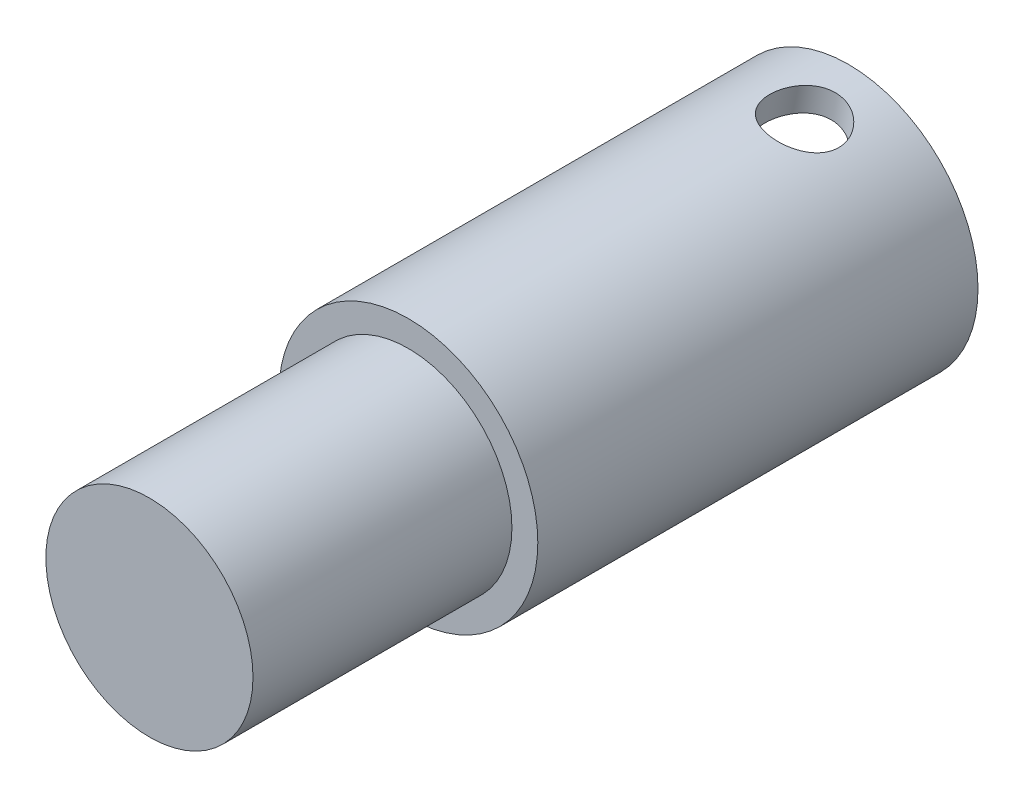
ISO-10303-21;
HEADER;
FILE_DESCRIPTION(('STEP AP214'),'2;1');
FILE_NAME('part.step','',(''),(''),'','','');
FILE_SCHEMA(('AUTOMOTIVE_DESIGN { 1 0 10303 214 1 1 1 1 }'));
ENDSEC;
DATA;
#1=APPLICATION_CONTEXT('core data for automotive mechanical design processes');
#2=APPLICATION_PROTOCOL_DEFINITION('international standard','automotive_design',2000,#1);
#3=PRODUCT_CONTEXT('',#1,'mechanical');
#4=PRODUCT('Part','Part','',(#3));
#5=PRODUCT_RELATED_PRODUCT_CATEGORY('part','',(#4));
#6=PRODUCT_DEFINITION_FORMATION('','',#4);
#7=PRODUCT_DEFINITION_CONTEXT('part definition',#1,'design');
#8=PRODUCT_DEFINITION('design','',#6,#7);
#9=PRODUCT_DEFINITION_SHAPE('','',#8);
#10=(LENGTH_UNIT() NAMED_UNIT(*) SI_UNIT(.MILLI.,.METRE.));
#11=(NAMED_UNIT(*) PLANE_ANGLE_UNIT() SI_UNIT($,.RADIAN.));
#12=(NAMED_UNIT(*) SI_UNIT($,.STERADIAN.) SOLID_ANGLE_UNIT());
#13=UNCERTAINTY_MEASURE_WITH_UNIT(LENGTH_MEASURE(1.E-05),#10,'distance_accuracy_value','');
#14=(GEOMETRIC_REPRESENTATION_CONTEXT(3) GLOBAL_UNCERTAINTY_ASSIGNED_CONTEXT((#13)) GLOBAL_UNIT_ASSIGNED_CONTEXT((#10,
#11,#12)) REPRESENTATION_CONTEXT('',''));
#15=CARTESIAN_POINT('',(0.,0.,0.));
#16=DIRECTION('',(0.,0.,1.));
#17=DIRECTION('',(1.,0.,0.));
#18=AXIS2_PLACEMENT_3D('',#15,#16,#17);
#19=CARTESIAN_POINT('',(0.,0.,13.5));
#20=DIRECTION('',(0.,0.,-1.));
#21=DIRECTION('',(-1.,0.,0.));
#22=AXIS2_PLACEMENT_3D('',#19,#20,#21);
#23=CYLINDRICAL_SURFACE('',#22,5.);
#24=CARTESIAN_POINT('',(-0.547085215267012,4.96997965460989,-11.));
#25=CARTESIAN_POINT('',(-0.547083321598174,4.96998060751569,-11.0744662451277));
#26=CARTESIAN_POINT('',(-0.540711911143652,4.9706938124909,-11.1489504370846));
#27=CARTESIAN_POINT('',(-0.515469381920347,4.97337381957333,-11.2957647987417));
#28=CARTESIAN_POINT('',(-0.496592228577024,4.97534122687138,-11.3680939109039));
#29=CARTESIAN_POINT('',(-0.447077244389713,4.98003359986975,-11.5084529313072));
#30=CARTESIAN_POINT('',(-0.416456277211684,4.98275747776716,-11.576488842031));
#31=CARTESIAN_POINT('',(-0.344480934785907,4.98824921962202,-11.7066130735163));
#32=CARTESIAN_POINT('',(-0.303125637390755,4.99101708733931,-11.7687008826703));
#33=CARTESIAN_POINT('',(-0.209846123031868,4.99581728937175,-11.8867643826359));
#34=CARTESIAN_POINT('',(-0.157698456401351,4.99783101859141,-11.9425643237734));
#35=CARTESIAN_POINT('',(-0.0449590733494553,5.00011526679256,-12.0449132115629));
#36=CARTESIAN_POINT('',(0.0156335388951549,5.0003856006941,-12.0914611755108));
#37=CARTESIAN_POINT('',(0.144641472704723,4.99832995771647,-12.174720962709));
#38=CARTESIAN_POINT('',(0.213169498459633,4.9959610118052,-12.2112575711502));
#39=CARTESIAN_POINT('',(0.355202729017113,4.98787357291976,-12.272313985301));
#40=CARTESIAN_POINT('',(0.428707066703341,4.98215566217689,-12.2968358784577));
#41=CARTESIAN_POINT('',(0.576687159543503,4.96717525326311,-12.3325965694713));
#42=CARTESIAN_POINT('',(0.651099322729406,4.95799935775511,-12.3441344458619));
#43=CARTESIAN_POINT('',(0.800283574052375,4.93611443218687,-12.3545410600551));
#44=CARTESIAN_POINT('',(0.875055598054032,4.92340601034404,-12.3534119774922));
#45=CARTESIAN_POINT('',(1.02079482867167,4.89523721075833,-12.338726257995));
#46=CARTESIAN_POINT('',(1.09181041892729,4.87985679077243,-12.3254928274463));
#47=CARTESIAN_POINT('',(1.23013040968751,4.84683796075532,-12.2874968471685));
#48=CARTESIAN_POINT('',(1.29743459529237,4.82919942016922,-12.262733630618));
#49=CARTESIAN_POINT('',(1.42729595417729,4.79243474392783,-12.2021365333472));
#50=CARTESIAN_POINT('',(1.48979806279616,4.77329533584077,-12.1661929253484));
#51=CARTESIAN_POINT('',(1.60783798770531,4.73484070135062,-12.0843398312213));
#52=CARTESIAN_POINT('',(1.66337440908328,4.71552544056018,-12.0384283539905));
#53=CARTESIAN_POINT('',(1.7678792995524,4.67737087757114,-11.936231245046));
#54=CARTESIAN_POINT('',(1.81658510229174,4.65856584631997,-11.8796638856812));
#55=CARTESIAN_POINT('',(1.90412953273557,4.62347501798437,-11.7586492894447));
#56=CARTESIAN_POINT('',(1.94296752216446,4.60718938388768,-11.6942015432486));
#57=CARTESIAN_POINT('',(2.01000910852481,4.57834140614818,-11.5586682669496));
#58=CARTESIAN_POINT('',(2.03814188382045,4.56580397216036,-11.4875422843988));
#59=CARTESIAN_POINT('',(2.08259321913688,4.54570206288559,-11.3410260903594));
#60=CARTESIAN_POINT('',(2.09891480714286,4.53813631307432,-11.265636977139));
#61=CARTESIAN_POINT('',(2.1189192826603,4.52882986367957,-11.1152152883209));
#62=CARTESIAN_POINT('',(2.12297484071241,4.5269174447979,-11.0402428371618));
#63=CARTESIAN_POINT('',(2.11937778266349,4.528602653463,-10.8906474685758));
#64=CARTESIAN_POINT('',(2.1117264538666,4.53219967518471,-10.8160245136228));
#65=CARTESIAN_POINT('',(2.08522857499778,4.54444996976621,-10.6707846619683));
#66=CARTESIAN_POINT('',(2.06660807763815,4.5530010912517,-10.6001175747511));
#67=CARTESIAN_POINT('',(2.01888265754548,4.57436246337573,-10.4631025838347));
#68=CARTESIAN_POINT('',(1.98977633649011,4.58717328204266,-10.3967552575851));
#69=CARTESIAN_POINT('',(1.92104627830005,4.61638401571195,-10.2686125154846));
#70=CARTESIAN_POINT('',(1.88120033191358,4.63285829886372,-10.2069533536525));
#71=CARTESIAN_POINT('',(1.79225540760774,4.66798698147889,-10.0914134341513));
#72=CARTESIAN_POINT('',(1.7431546378835,4.68664180284512,-10.0375341863067));
#73=CARTESIAN_POINT('',(1.63520303592371,4.72540908372448,-9.93743118339922));
#74=CARTESIAN_POINT('',(1.57610493673625,4.74554843073444,-9.89148391650718));
#75=CARTESIAN_POINT('',(1.45067092921861,4.78538163191099,-9.81058034381805));
#76=CARTESIAN_POINT('',(1.3843354064694,4.80507550974298,-9.77562345288248));
#77=CARTESIAN_POINT('',(1.24665904626364,4.84261170365861,-9.71801703299766));
#78=CARTESIAN_POINT('',(1.17536051427002,4.86046706580384,-9.69527513911034));
#79=CARTESIAN_POINT('',(1.02930781062782,4.8934776531844,-9.66247891969335));
#80=CARTESIAN_POINT('',(0.95455443279308,4.90863349483726,-9.6524216945063));
#81=CARTESIAN_POINT('',(0.806215626463691,4.93513074634238,-9.6454663266512));
#82=CARTESIAN_POINT('',(0.732667720519123,4.94657738446424,-9.64816316127778));
#83=CARTESIAN_POINT('',(0.586575355129643,4.9660205448129,-9.66569588680142));
#84=CARTESIAN_POINT('',(0.514030856155521,4.97401720332847,-9.68053129810629));
#85=CARTESIAN_POINT('',(0.372558339430831,4.98660324877152,-9.72168840902185));
#86=CARTESIAN_POINT('',(0.303607864781299,4.99121698297595,-9.7479258225676));
#87=CARTESIAN_POINT('',(0.170636154849089,4.9975313176076,-9.81106703223902));
#88=CARTESIAN_POINT('',(0.106615627788326,4.99923150022534,-9.84797235727916));
#89=CARTESIAN_POINT('',(-0.0164668102881935,5.0003622988874,-9.93257531391776));
#90=CARTESIAN_POINT('',(-0.075345757851252,4.99972972234522,-9.98053994506002));
#91=CARTESIAN_POINT('',(-0.184509957524835,4.99689345804244,-10.0853964340939));
#92=CARTESIAN_POINT('',(-0.234792922361951,4.99468935292379,-10.1422906603281));
#93=CARTESIAN_POINT('',(-0.326337601576946,4.98955492681884,-10.2649525919399));
#94=CARTESIAN_POINT('',(-0.367367332822861,4.98660918507151,-10.3308931252633));
#95=CARTESIAN_POINT('',(-0.437519248966799,4.98094606210139,-10.468814625793));
#96=CARTESIAN_POINT('',(-0.466649006342541,4.97822853653208,-10.5407917164098));
#97=CARTESIAN_POINT('',(-0.508375039053716,4.97412504690405,-10.6770560593604));
#98=CARTESIAN_POINT('',(-0.522852928505865,4.97259676119865,-10.7407685910123));
#99=CARTESIAN_POINT('',(-0.542208260645173,4.97052370790588,-10.8696496171006));
#100=CARTESIAN_POINT('',(-0.547086872840164,4.9699788205089,-10.934817933196));
#101=CARTESIAN_POINT('',(-0.547085215267012,4.96997965460989,-11.));
#102=B_SPLINE_CURVE_WITH_KNOTS('',3,(#24,#25,#26,#27,#28,#29,#30,#31,#32,#33,#34,#35,#36,#37,
#38,#39,#40,#41,#42,#43,#44,#45,#46,#47,#48,#49,#50,#51,#52,#53,#54,#55,#56,#57,#58,#59,#60,#61,
#62,#63,#64,#65,#66,#67,#68,#69,#70,#71,#72,#73,#74,#75,#76,#77,#78,#79,#80,#81,#82,#83,#84,#85,
#86,#87,#88,#89,#90,#91,#92,#93,#94,#95,#96,#97,#98,#99,#100,#101),.UNSPECIFIED.,.T.,.F.,(4,2,2,
2,2,2,2,2,2,2,2,2,2,2,2,2,2,2,2,2,2,2,2,2,2,2,2,2,2,2,2,2,2,2,2,2,2,2,4),(0.,0.223158971319737,
0.446425705234324,0.669373029858269,0.892339513421352,1.12049196410997,1.34866863520864,
1.58061515285875,1.81252135761807,2.03896881868822,2.26537731498979,2.48591139891143,
2.70645823893681,2.92924177634403,3.15206985623524,3.38193184216986,3.61180869238737,
3.84318092210092,4.07449381484002,4.29870449991732,4.52289053227474,4.74261062665067,
4.96236003234462,5.1870610190489,5.41180555435868,5.64325797169597,5.87469806418976,
6.10436254033136,6.33397450670088,6.5563446970923,6.7787061021164,6.99945100329827,
7.22022755711893,7.44702816047026,7.67388901874331,7.90592550303216,8.13781410141318,
8.33317423343228,8.52851056268489),.UNSPECIFIED.);
#103=CARTESIAN_POINT('',(-0.547085215267012,4.96997965460989,-11.));
#104=VERTEX_POINT('',#103);
#105=EDGE_CURVE('E67',#104,#104,#102,.T.);
#106=ORIENTED_EDGE('',*,*,#105,.T.);
#107=EDGE_LOOP('',(#106));
#108=FACE_BOUND('',#107,.T.);
#109=CARTESIAN_POINT('',(0.,0.,-13.5));
#110=DIRECTION('',(0.,0.,1.));
#111=DIRECTION('',(1.,0.,0.));
#112=AXIS2_PLACEMENT_3D('',#109,#110,#111);
#113=CIRCLE('',#112,5.);
#114=CARTESIAN_POINT('',(5.,0.,-13.5));
#115=VERTEX_POINT('',#114);
#116=EDGE_CURVE('E10',#115,#115,#113,.T.);
#117=ORIENTED_EDGE('',*,*,#116,.T.);
#118=EDGE_LOOP('',(#117));
#119=FACE_BOUND('',#118,.T.);
#120=CARTESIAN_POINT('',(0.,0.,3.5));
#121=DIRECTION('',(0.,0.,1.));
#122=DIRECTION('',(1.,0.,0.));
#123=AXIS2_PLACEMENT_3D('',#120,#121,#122);
#124=CIRCLE('',#123,5.);
#125=CARTESIAN_POINT('',(5.,0.,3.5));
#126=VERTEX_POINT('',#125);
#127=EDGE_CURVE('E44',#126,#126,#124,.T.);
#128=ORIENTED_EDGE('',*,*,#127,.F.);
#129=EDGE_LOOP('',(#128));
#130=FACE_BOUND('',#129,.T.);
#131=ADVANCED_FACE('F37',(#108,#119,#130),#23,.T.);
#132=CARTESIAN_POINT('',(0.,0.,-13.5));
#133=DIRECTION('',(0.,0.,1.));
#134=DIRECTION('',(1.,0.,0.));
#135=AXIS2_PLACEMENT_3D('',#132,#133,#134);
#136=PLANE('',#135);
#137=CARTESIAN_POINT('',(0.,0.,-13.5));
#138=DIRECTION('',(0.,0.,-1.));
#139=DIRECTION('',(-1.,0.,0.));
#140=AXIS2_PLACEMENT_3D('',#137,#138,#139);
#141=CIRCLE('',#140,4.);
#142=CARTESIAN_POINT('',(-4.,0.,-13.5));
#143=VERTEX_POINT('',#142);
#144=EDGE_CURVE('E58',#143,#143,#141,.T.);
#145=ORIENTED_EDGE('',*,*,#144,.F.);
#146=EDGE_LOOP('',(#145));
#147=FACE_BOUND('',#146,.T.);
#148=ORIENTED_EDGE('',*,*,#116,.F.);
#149=EDGE_LOOP('',(#148));
#150=FACE_BOUND('',#149,.T.);
#151=ADVANCED_FACE('F112',(#147,#150),#136,.F.);
#152=CARTESIAN_POINT('',(0.,0.,3.5));
#153=DIRECTION('',(0.,0.,1.));
#154=DIRECTION('',(1.,0.,0.));
#155=AXIS2_PLACEMENT_3D('',#152,#153,#154);
#156=PLANE('',#155);
#157=CARTESIAN_POINT('',(0.,0.,3.5));
#158=DIRECTION('',(0.,0.,1.));
#159=DIRECTION('',(1.,0.,0.));
#160=AXIS2_PLACEMENT_3D('',#157,#158,#159);
#161=CIRCLE('',#160,4.);
#162=CARTESIAN_POINT('',(4.,0.,3.5));
#163=VERTEX_POINT('',#162);
#164=EDGE_CURVE('E48',#163,#163,#161,.T.);
#165=ORIENTED_EDGE('',*,*,#164,.F.);
#166=EDGE_LOOP('',(#165));
#167=FACE_BOUND('',#166,.T.);
#168=ORIENTED_EDGE('',*,*,#127,.T.);
#169=EDGE_LOOP('',(#168));
#170=FACE_BOUND('',#169,.T.);
#171=ADVANCED_FACE('F108',(#167,#170),#156,.T.);
#172=CARTESIAN_POINT('',(0.,0.,3.5));
#173=DIRECTION('',(0.,0.,1.));
#174=DIRECTION('',(1.,0.,0.));
#175=AXIS2_PLACEMENT_3D('',#172,#173,#174);
#176=CYLINDRICAL_SURFACE('',#175,4.);
#177=ORIENTED_EDGE('',*,*,#164,.T.);
#178=EDGE_LOOP('',(#177));
#179=FACE_BOUND('',#178,.T.);
#180=CARTESIAN_POINT('',(0.,0.,13.5));
#181=DIRECTION('',(0.,0.,1.));
#182=DIRECTION('',(1.,0.,0.));
#183=AXIS2_PLACEMENT_3D('',#180,#181,#182);
#184=CIRCLE('',#183,4.);
#185=CARTESIAN_POINT('',(4.,0.,13.5));
#186=VERTEX_POINT('',#185);
#187=EDGE_CURVE('E52',#186,#186,#184,.T.);
#188=ORIENTED_EDGE('',*,*,#187,.F.);
#189=EDGE_LOOP('',(#188));
#190=FACE_BOUND('',#189,.T.);
#191=ADVANCED_FACE('F105',(#179,#190),#176,.T.);
#192=CARTESIAN_POINT('',(0.,0.,13.5));
#193=DIRECTION('',(0.,0.,1.));
#194=DIRECTION('',(1.,0.,0.));
#195=AXIS2_PLACEMENT_3D('',#192,#193,#194);
#196=PLANE('',#195);
#197=ORIENTED_EDGE('',*,*,#187,.T.);
#198=EDGE_LOOP('',(#197));
#199=FACE_BOUND('',#198,.T.);
#200=ADVANCED_FACE('F103',(#199),#196,.T.);
#201=CARTESIAN_POINT('',(0.,0.,-6.));
#202=DIRECTION('',(0.,0.,-1.));
#203=DIRECTION('',(-1.,0.,0.));
#204=AXIS2_PLACEMENT_3D('',#201,#202,#203);
#205=CYLINDRICAL_SURFACE('',#204,4.);
#206=CARTESIAN_POINT('',(-0.718679788540663,3.93490779581214,-11.));
#207=CARTESIAN_POINT('',(-0.718680426599016,3.93490745451382,-10.9263971999177));
#208=CARTESIAN_POINT('',(-0.712375817954318,3.93607475287169,-10.8527982278257));
#209=CARTESIAN_POINT('',(-0.687444036782304,3.94050473147981,-10.7077850422166));
#210=CARTESIAN_POINT('',(-0.668815128722706,3.94376770684557,-10.6363711378871));
#211=CARTESIAN_POINT('',(-0.620056262009329,3.95172534707849,-10.4978531660034));
#212=CARTESIAN_POINT('',(-0.589949377124763,3.95641713587017,-10.4307407654211));
#213=CARTESIAN_POINT('',(-0.519297905133776,3.96630780356189,-10.3023003933631));
#214=CARTESIAN_POINT('',(-0.478750912118459,3.97150679917531,-10.2409737596666));
#215=CARTESIAN_POINT('',(-0.386779127887503,3.98153413767408,-10.1233757836684));
#216=CARTESIAN_POINT('',(-0.33501075565525,3.98634197225961,-10.0673713367696));
#217=CARTESIAN_POINT('',(-0.223017703365334,3.99417206116296,-9.96440759551157));
#218=CARTESIAN_POINT('',(-0.162791623327211,3.99719401943754,-9.91744980167758));
#219=CARTESIAN_POINT('',(-0.0337678700539059,4.00039105004643,-9.83269322890221));
#220=CARTESIAN_POINT('',(0.0352169982362019,4.00048724182596,-9.79517524386474));
#221=CARTESIAN_POINT('',(0.178395826919074,3.99666034763305,-9.73222348308074));
#222=CARTESIAN_POINT('',(0.252588333415771,3.99273837934713,-9.70678634981885));
#223=CARTESIAN_POINT('',(0.401159282793932,3.98050572039852,-9.66962680853822));
#224=CARTESIAN_POINT('',(0.475436408075797,3.97235680953553,-9.65744693942037));
#225=CARTESIAN_POINT('',(0.624370618012054,3.95168411088176,-9.64569187780766));
#226=CARTESIAN_POINT('',(0.699027596706139,3.93916148357959,-9.6461133442776));
#227=CARTESIAN_POINT('',(0.843421230588408,3.910734072443,-9.65926142740786));
#228=CARTESIAN_POINT('',(0.913234876050815,3.894986123413,-9.67149091130425));
#229=CARTESIAN_POINT('',(1.04920360117714,3.86058189086146,-9.70708422510594));
#230=CARTESIAN_POINT('',(1.11535843076081,3.84192540887355,-9.73044881504922));
#231=CARTESIAN_POINT('',(1.24325979396013,3.80247914414222,-9.78793259443377));
#232=CARTESIAN_POINT('',(1.30493577457131,3.78166423015702,-9.82219104923123));
#233=CARTESIAN_POINT('',(1.42157508832163,3.73938214107458,-9.90037447692953));
#234=CARTESIAN_POINT('',(1.47653651045246,3.71791478244801,-9.94430219184639));
#235=CARTESIAN_POINT('',(1.58114071004973,3.67469080842092,-10.0430706158013));
#236=CARTESIAN_POINT('',(1.63039773337175,3.65297041119087,-10.0983363481951));
#237=CARTESIAN_POINT('',(1.71930242938072,3.61198029901392,-10.2169388394701));
#238=CARTESIAN_POINT('',(1.75894853029935,3.59271098516129,-10.2802769159201));
#239=CARTESIAN_POINT('',(1.82820362760502,3.55797708782562,-10.4144832602656));
#240=CARTESIAN_POINT('',(1.85765263566607,3.54257411054595,-10.4854504862512));
#241=CARTESIAN_POINT('',(1.904791252721,3.51745535130593,-10.6321338239256));
#242=CARTESIAN_POINT('',(1.92248596225101,3.50773710279334,-10.7078478602043));
#243=CARTESIAN_POINT('',(1.94497984801757,3.4953128378668,-10.8581228073454));
#244=CARTESIAN_POINT('',(1.95033781921015,3.49230317060317,-10.9325749754034));
#245=CARTESIAN_POINT('',(1.94962266341248,3.49270278741565,-11.0813988065623));
#246=CARTESIAN_POINT('',(1.94355169072203,3.49611086177901,-11.1557704821916));
#247=CARTESIAN_POINT('',(1.92061760650797,3.50875861146769,-11.2995519702527));
#248=CARTESIAN_POINT('',(1.90414756740979,3.51778572495239,-11.3690441335145));
#249=CARTESIAN_POINT('',(1.86127369577998,3.54065622179711,-11.5040522804074));
#250=CARTESIAN_POINT('',(1.83486807021565,3.55450047445162,-11.5695675438645));
#251=CARTESIAN_POINT('',(1.7717772048573,3.58637557932672,-11.6971161205226));
#252=CARTESIAN_POINT('',(1.73478654585789,3.60452757466378,-11.7589677717333));
#253=CARTESIAN_POINT('',(1.65174695714225,3.64332664786968,-11.8753883139622));
#254=CARTESIAN_POINT('',(1.60569528283882,3.66397448099671,-11.9299549899299));
#255=CARTESIAN_POINT('',(1.50294718919186,3.70734485276119,-12.0330629874053));
#256=CARTESIAN_POINT('',(1.4458352406836,3.73011950309701,-12.0811696165229));
#257=CARTESIAN_POINT('',(1.32387501180809,3.77512567064469,-12.1666510484827));
#258=CARTESIAN_POINT('',(1.25902698200609,3.79735720541952,-12.2040261987751));
#259=CARTESIAN_POINT('',(1.12357891261586,3.83960484958231,-12.2666485596847));
#260=CARTESIAN_POINT('',(1.05301832603469,3.85963422238615,-12.2919718298559));
#261=CARTESIAN_POINT('',(0.907737993924183,3.89635924473951,-12.3298927796087));
#262=CARTESIAN_POINT('',(0.833019809253443,3.91305613472528,-12.3424952013329));
#263=CARTESIAN_POINT('',(0.685384813138161,3.94152601905645,-12.3541802269122));
#264=CARTESIAN_POINT('',(0.612555133673765,3.95349778096204,-12.3538860493305));
#265=CARTESIAN_POINT('',(0.467371104758996,3.97327705624865,-12.3413307985143));
#266=CARTESIAN_POINT('',(0.395016715371568,3.98108492404555,-12.3290707440243));
#267=CARTESIAN_POINT('',(0.254104718264006,3.99253674881746,-12.293348554393));
#268=CARTESIAN_POINT('',(0.185503824740977,3.99624823126319,-12.2700774062053));
#269=CARTESIAN_POINT('',(0.0526430377262971,4.00020636276331,-12.2131717097245));
#270=CARTESIAN_POINT('',(-0.0116160606224997,4.0004523788654,-12.1795352694025));
#271=CARTESIAN_POINT('',(-0.136490319516103,3.99817688069672,-12.1013992243643));
#272=CARTESIAN_POINT('',(-0.19687753627692,3.99555093161225,-12.0565386351762));
#273=CARTESIAN_POINT('',(-0.30969132938417,3.98839470874937,-11.9578365825246));
#274=CARTESIAN_POINT('',(-0.362115318231447,3.98386381779058,-11.903992211827));
#275=CARTESIAN_POINT('',(-0.459517302607371,3.9738320776392,-11.7862378709922));
#276=CARTESIAN_POINT('',(-0.504106430562971,3.9682993091391,-11.7220079210974));
#277=CARTESIAN_POINT('',(-0.58162247495959,3.95768282201694,-11.5868203031801));
#278=CARTESIAN_POINT('',(-0.614552015293442,3.95259900255619,-11.5158641533951));
#279=CARTESIAN_POINT('',(-0.666515844381233,3.94416398515167,-11.3717810276144));
#280=CARTESIAN_POINT('',(-0.686002654919925,3.94075759822852,-11.2988210002585));
#281=CARTESIAN_POINT('',(-0.712081899084044,3.9361300851071,-11.1505720615526));
#282=CARTESIAN_POINT('',(-0.71867913590784,3.93490814490637,-11.0752840283439));
#283=CARTESIAN_POINT('',(-0.718679788540663,3.93490779581214,-11.));
#284=B_SPLINE_CURVE_WITH_KNOTS('',3,(#206,#207,#208,#209,#210,#211,#212,#213,#214,#215,#216,
#217,#218,#219,#220,#221,#222,#223,#224,#225,#226,#227,#228,#229,#230,#231,#232,#233,#234,#235,
#236,#237,#238,#239,#240,#241,#242,#243,#244,#245,#246,#247,#248,#249,#250,#251,#252,#253,#254,
#255,#256,#257,#258,#259,#260,#261,#262,#263,#264,#265,#266,#267,#268,#269,#270,#271,#272,#273,
#274,#275,#276,#277,#278,#279,#280,#281,#282,#283),.UNSPECIFIED.,.T.,.F.,(4,2,2,2,2,2,2,2,2,2,2,
2,2,2,2,2,2,2,2,2,2,2,2,2,2,2,2,2,2,2,2,2,2,2,2,2,2,2,4),(0.,0.220529438514918,0.44108993903503,
0.661209372812338,0.881379578288907,1.1096015768572,1.33786139699303,1.57226994665544,
1.80661331121824,2.03258540253036,2.25849758162044,2.47529541713999,2.69210805253584,
2.91181204525087,3.13157842223993,3.36197284137462,3.5924049137862,3.82630396216286,
4.06010144844147,4.28308109465932,4.50601871451719,4.72099635565583,4.9360128115094,
5.15799778986612,5.38005011141247,5.61314711408287,5.84623656898379,6.07783481908514,
6.30934670089429,6.5296838709567,6.75000228370717,6.96663202517593,7.18330133260837,
7.40811957297531,7.6330107081979,7.86703524127107,8.1010070755545,8.32665792990396,
8.55222468118564),.UNSPECIFIED.);
#285=CARTESIAN_POINT('',(-0.718679788540663,3.93490779581214,-11.));
#286=VERTEX_POINT('',#285);
#287=EDGE_CURVE('E76',#286,#286,#284,.T.);
#288=ORIENTED_EDGE('',*,*,#287,.T.);
#289=EDGE_LOOP('',(#288));
#290=FACE_BOUND('',#289,.T.);
#291=CARTESIAN_POINT('',(0.,0.,-6.));
#292=DIRECTION('',(0.,0.,-1.));
#293=DIRECTION('',(-1.,0.,0.));
#294=AXIS2_PLACEMENT_3D('',#291,#292,#293);
#295=CIRCLE('',#294,4.);
#296=CARTESIAN_POINT('',(-4.,0.,-6.));
#297=VERTEX_POINT('',#296);
#298=EDGE_CURVE('E56',#297,#297,#295,.T.);
#299=ORIENTED_EDGE('',*,*,#298,.F.);
#300=EDGE_LOOP('',(#299));
#301=FACE_BOUND('',#300,.T.);
#302=ORIENTED_EDGE('',*,*,#144,.T.);
#303=EDGE_LOOP('',(#302));
#304=FACE_BOUND('',#303,.T.);
#305=ADVANCED_FACE('F99',(#290,#301,#304),#205,.F.);
#306=CARTESIAN_POINT('',(0.,0.,-6.));
#307=DIRECTION('',(0.,0.,-1.));
#308=DIRECTION('',(-1.,0.,0.));
#309=AXIS2_PLACEMENT_3D('',#306,#307,#308);
#310=PLANE('',#309);
#311=CARTESIAN_POINT('',(0.,0.,-6.));
#312=DIRECTION('',(0.,0.,-1.));
#313=DIRECTION('',(-1.,0.,0.));
#314=AXIS2_PLACEMENT_3D('',#311,#312,#313);
#315=CIRCLE('',#314,3.1);
#316=CARTESIAN_POINT('',(-3.1,0.,-6.));
#317=VERTEX_POINT('',#316);
#318=EDGE_CURVE('E64',#317,#317,#315,.T.);
#319=ORIENTED_EDGE('',*,*,#318,.F.);
#320=EDGE_LOOP('',(#319));
#321=FACE_BOUND('',#320,.T.);
#322=ORIENTED_EDGE('',*,*,#298,.T.);
#323=EDGE_LOOP('',(#322));
#324=FACE_BOUND('',#323,.T.);
#325=ADVANCED_FACE('F95',(#321,#324),#310,.T.);
#326=CARTESIAN_POINT('',(0.,0.,1.));
#327=DIRECTION('',(0.,0.,-1.));
#328=DIRECTION('',(-1.,0.,0.));
#329=AXIS2_PLACEMENT_3D('',#326,#327,#328);
#330=CYLINDRICAL_SURFACE('',#329,3.1);
#331=CARTESIAN_POINT('',(0.,0.,1.));
#332=DIRECTION('',(0.,0.,-1.));
#333=DIRECTION('',(-1.,0.,0.));
#334=AXIS2_PLACEMENT_3D('',#331,#332,#333);
#335=CIRCLE('',#334,3.1);
#336=CARTESIAN_POINT('',(-3.1,0.,1.));
#337=VERTEX_POINT('',#336);
#338=EDGE_CURVE('E61',#337,#337,#335,.T.);
#339=ORIENTED_EDGE('',*,*,#338,.F.);
#340=EDGE_LOOP('',(#339));
#341=FACE_BOUND('',#340,.T.);
#342=ORIENTED_EDGE('',*,*,#318,.T.);
#343=EDGE_LOOP('',(#342));
#344=FACE_BOUND('',#343,.T.);
#345=ADVANCED_FACE('F91',(#341,#344),#330,.F.);
#346=CARTESIAN_POINT('',(0.,0.,1.));
#347=DIRECTION('',(0.,0.,-1.));
#348=DIRECTION('',(-1.,0.,0.));
#349=AXIS2_PLACEMENT_3D('',#346,#347,#348);
#350=PLANE('',#349);
#351=ORIENTED_EDGE('',*,*,#338,.T.);
#352=EDGE_LOOP('',(#351));
#353=FACE_BOUND('',#352,.T.);
#354=ADVANCED_FACE('F84',(#353),#350,.T.);
#355=CARTESIAN_POINT('',(0.817740868880748,4.93267674507079,-11.));
#356=DIRECTION('',(0.16354817377615,0.986535349014158,0.));
#357=DIRECTION('',(-0.986535349014158,0.16354817377615,0.));
#358=AXIS2_PLACEMENT_3D('',#355,#356,#357);
#359=CYLINDRICAL_SURFACE('',#358,1.35254999999999);
#360=ORIENTED_EDGE('',*,*,#287,.F.);
#361=EDGE_LOOP('',(#360));
#362=FACE_BOUND('',#361,.T.);
#363=ORIENTED_EDGE('',*,*,#105,.F.);
#364=EDGE_LOOP('',(#363));
#365=FACE_BOUND('',#364,.T.);
#366=ADVANCED_FACE('F81',(#362,#365),#359,.F.);
#367=CLOSED_SHELL('',(#131,#151,#171,#191,#200,#305,#325,#345,#354,#366));
#368=MANIFOLD_SOLID_BREP('B2',#367);
#369=ADVANCED_BREP_SHAPE_REPRESENTATION('',(#18,#368),#14);
#370=SHAPE_DEFINITION_REPRESENTATION(#9,#369);
ENDSEC;
END-ISO-10303-21;
